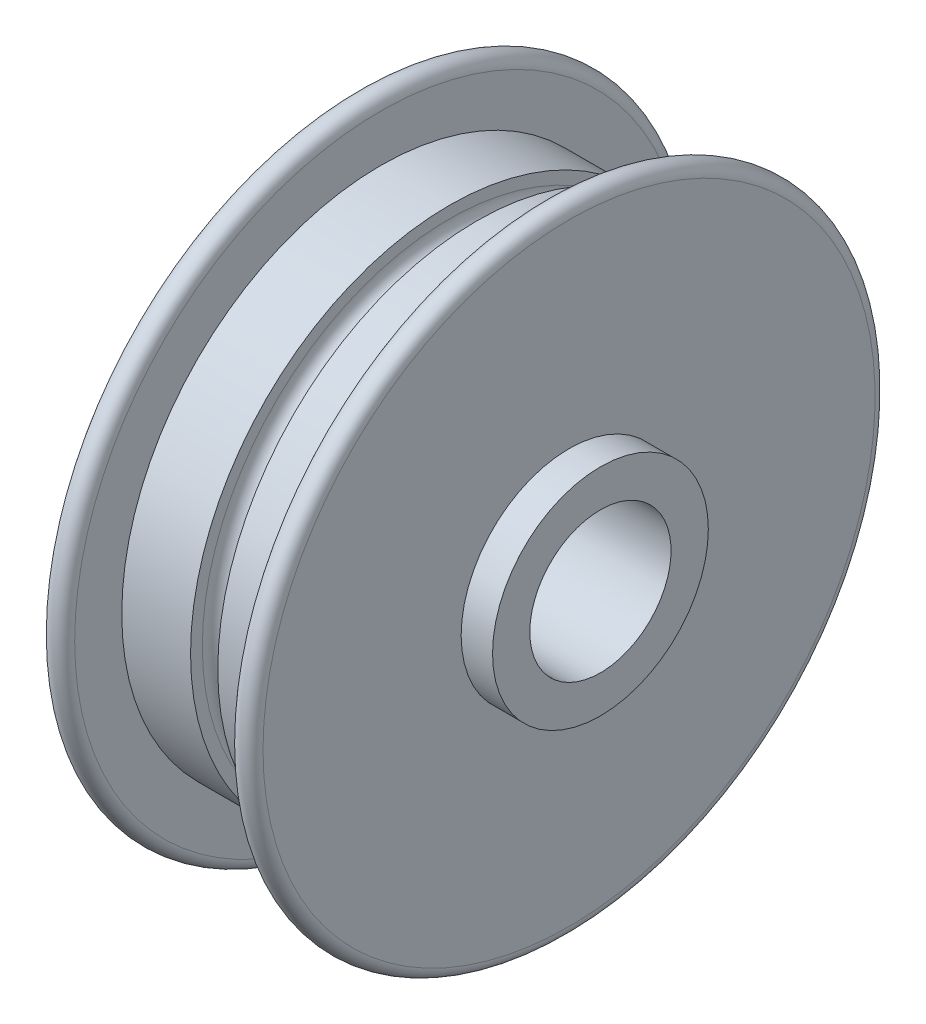
ISO-10303-21;
HEADER;
FILE_DESCRIPTION(('STEP AP214'),'2;1');
FILE_NAME('part.step','',(''),(''),'','','');
FILE_SCHEMA(('AUTOMOTIVE_DESIGN { 1 0 10303 214 1 1 1 1 }'));
ENDSEC;
DATA;
#1=APPLICATION_CONTEXT('core data for automotive mechanical design processes');
#2=APPLICATION_PROTOCOL_DEFINITION('international standard','automotive_design',2000,#1);
#3=PRODUCT_CONTEXT('',#1,'mechanical');
#4=PRODUCT('Part','Part','',(#3));
#5=PRODUCT_RELATED_PRODUCT_CATEGORY('part','',(#4));
#6=PRODUCT_DEFINITION_FORMATION('','',#4);
#7=PRODUCT_DEFINITION_CONTEXT('part definition',#1,'design');
#8=PRODUCT_DEFINITION('design','',#6,#7);
#9=PRODUCT_DEFINITION_SHAPE('','',#8);
#10=(LENGTH_UNIT() NAMED_UNIT(*) SI_UNIT(.MILLI.,.METRE.));
#11=(NAMED_UNIT(*) PLANE_ANGLE_UNIT() SI_UNIT($,.RADIAN.));
#12=(NAMED_UNIT(*) SI_UNIT($,.STERADIAN.) SOLID_ANGLE_UNIT());
#13=UNCERTAINTY_MEASURE_WITH_UNIT(LENGTH_MEASURE(1.E-05),#10,'distance_accuracy_value','');
#14=(GEOMETRIC_REPRESENTATION_CONTEXT(3) GLOBAL_UNCERTAINTY_ASSIGNED_CONTEXT((#13)) GLOBAL_UNIT_ASSIGNED_CONTEXT((#10,
#11,#12)) REPRESENTATION_CONTEXT('',''));
#15=CARTESIAN_POINT('',(0.,0.,0.));
#16=DIRECTION('',(0.,0.,1.));
#17=DIRECTION('',(1.,0.,0.));
#18=AXIS2_PLACEMENT_3D('',#15,#16,#17);
#19=CARTESIAN_POINT('',(0.,0.,0.));
#20=DIRECTION('',(-1.,0.,0.));
#21=DIRECTION('',(0.,0.,1.));
#22=AXIS2_PLACEMENT_3D('',#19,#20,#21);
#23=CYLINDRICAL_SURFACE('',#22,8.9999999793353);
#24=CARTESIAN_POINT('',(35.0006098889832,0.,0.));
#25=DIRECTION('',(-1.,0.,0.));
#26=DIRECTION('',(0.,0.,1.));
#27=AXIS2_PLACEMENT_3D('',#24,#25,#26);
#28=CIRCLE('',#27,8.9999999793353);
#29=CARTESIAN_POINT('',(35.0006098889832,0.,8.9999999793353));
#30=VERTEX_POINT('',#29);
#31=EDGE_CURVE('E10',#30,#30,#28,.T.);
#32=ORIENTED_EDGE('',*,*,#31,.F.);
#33=EDGE_LOOP('',(#32));
#34=FACE_BOUND('',#33,.T.);
#35=CARTESIAN_POINT('',(0.000609888983155578,0.,0.));
#36=DIRECTION('',(-1.,0.,0.));
#37=DIRECTION('',(0.,0.,1.));
#38=AXIS2_PLACEMENT_3D('',#35,#36,#37);
#39=CIRCLE('',#38,8.9999999793353);
#40=CARTESIAN_POINT('',(0.000609888983155578,0.,8.9999999793353));
#41=VERTEX_POINT('',#40);
#42=EDGE_CURVE('E83',#41,#41,#39,.T.);
#43=ORIENTED_EDGE('',*,*,#42,.T.);
#44=EDGE_LOOP('',(#43));
#45=FACE_BOUND('',#44,.T.);
#46=ADVANCED_FACE('F31',(#34,#45),#23,.F.);
#47=CARTESIAN_POINT('',(35.0006098889832,13.749999986474,0.));
#48=DIRECTION('',(-1.,0.,0.));
#49=DIRECTION('',(0.,0.,1.));
#50=AXIS2_PLACEMENT_3D('',#47,#48,#49);
#51=PLANE('',#50);
#52=CARTESIAN_POINT('',(35.0006098889832,0.,0.));
#53=DIRECTION('',(-1.,0.,0.));
#54=DIRECTION('',(0.,0.,1.));
#55=AXIS2_PLACEMENT_3D('',#52,#53,#54);
#56=CIRCLE('',#55,13.749999986474);
#57=CARTESIAN_POINT('',(35.0006098889832,0.,13.749999986474));
#58=VERTEX_POINT('',#57);
#59=EDGE_CURVE('E37',#58,#58,#56,.T.);
#60=ORIENTED_EDGE('',*,*,#59,.F.);
#61=EDGE_LOOP('',(#60));
#62=FACE_BOUND('',#61,.T.);
#63=ORIENTED_EDGE('',*,*,#31,.T.);
#64=EDGE_LOOP('',(#63));
#65=FACE_BOUND('',#64,.T.);
#66=ADVANCED_FACE('F168',(#62,#65),#51,.F.);
#67=CARTESIAN_POINT('',(0.,0.,0.));
#68=DIRECTION('',(-1.,0.,0.));
#69=DIRECTION('',(0.,0.,1.));
#70=AXIS2_PLACEMENT_3D('',#67,#68,#69);
#71=CYLINDRICAL_SURFACE('',#70,13.749999986474);
#72=CARTESIAN_POINT('',(31.0006098889832,0.,0.));
#73=DIRECTION('',(-1.,0.,0.));
#74=DIRECTION('',(0.,0.,1.));
#75=AXIS2_PLACEMENT_3D('',#72,#73,#74);
#76=CIRCLE('',#75,13.749999986474);
#77=CARTESIAN_POINT('',(31.0006098889832,0.,13.749999986474));
#78=VERTEX_POINT('',#77);
#79=EDGE_CURVE('E41',#78,#78,#76,.T.);
#80=ORIENTED_EDGE('',*,*,#79,.F.);
#81=EDGE_LOOP('',(#80));
#82=FACE_BOUND('',#81,.T.);
#83=ORIENTED_EDGE('',*,*,#59,.T.);
#84=EDGE_LOOP('',(#83));
#85=FACE_BOUND('',#84,.T.);
#86=ADVANCED_FACE('F163',(#82,#85),#71,.T.);
#87=CARTESIAN_POINT('',(31.0006098889832,39.,0.));
#88=DIRECTION('',(-1.,0.,0.));
#89=DIRECTION('',(0.,0.,1.));
#90=AXIS2_PLACEMENT_3D('',#87,#88,#89);
#91=PLANE('',#90);
#92=CARTESIAN_POINT('',(31.0006098889832,0.,0.));
#93=DIRECTION('',(-1.,0.,0.));
#94=DIRECTION('',(0.,0.,1.));
#95=AXIS2_PLACEMENT_3D('',#92,#93,#94);
#96=CIRCLE('',#95,39.);
#97=CARTESIAN_POINT('',(31.0006098889832,0.,39.));
#98=VERTEX_POINT('',#97);
#99=EDGE_CURVE('E45',#98,#98,#96,.T.);
#100=ORIENTED_EDGE('',*,*,#99,.F.);
#101=EDGE_LOOP('',(#100));
#102=FACE_BOUND('',#101,.T.);
#103=ORIENTED_EDGE('',*,*,#79,.T.);
#104=EDGE_LOOP('',(#103));
#105=FACE_BOUND('',#104,.T.);
#106=ADVANCED_FACE('F157',(#102,#105),#91,.F.);
#107=CARTESIAN_POINT('',(29.5006098889832,0.,0.));
#108=DIRECTION('',(-1.,0.,0.));
#109=DIRECTION('',(0.,0.,1.));
#110=AXIS2_PLACEMENT_3D('',#107,#108,#109);
#111=TOROIDAL_SURFACE('',#110,39.,1.5);
#112=CARTESIAN_POINT('',(28.0006098889832,0.,0.));
#113=DIRECTION('',(-1.,0.,0.));
#114=DIRECTION('',(0.,0.,1.));
#115=AXIS2_PLACEMENT_3D('',#112,#113,#114);
#116=CIRCLE('',#115,39.);
#117=CARTESIAN_POINT('',(28.0006098889832,0.,39.));
#118=VERTEX_POINT('',#117);
#119=EDGE_CURVE('E50',#118,#118,#116,.T.);
#120=ORIENTED_EDGE('',*,*,#119,.F.);
#121=EDGE_LOOP('',(#120));
#122=FACE_BOUND('',#121,.T.);
#123=ORIENTED_EDGE('',*,*,#99,.T.);
#124=EDGE_LOOP('',(#123));
#125=FACE_BOUND('',#124,.T.);
#126=ADVANCED_FACE('F151',(#122,#125),#111,.T.);
#127=CARTESIAN_POINT('',(28.0006098889832,33.,0.));
#128=DIRECTION('',(1.,0.,0.));
#129=DIRECTION('',(0.,0.,-1.));
#130=AXIS2_PLACEMENT_3D('',#127,#128,#129);
#131=PLANE('',#130);
#132=CARTESIAN_POINT('',(28.0006098889832,0.,0.));
#133=DIRECTION('',(-1.,0.,0.));
#134=DIRECTION('',(0.,0.,1.));
#135=AXIS2_PLACEMENT_3D('',#132,#133,#134);
#136=CIRCLE('',#135,33.);
#137=CARTESIAN_POINT('',(28.0006098889832,0.,33.));
#138=VERTEX_POINT('',#137);
#139=EDGE_CURVE('E53',#138,#138,#136,.T.);
#140=ORIENTED_EDGE('',*,*,#139,.F.);
#141=EDGE_LOOP('',(#140));
#142=FACE_BOUND('',#141,.T.);
#143=ORIENTED_EDGE('',*,*,#119,.T.);
#144=EDGE_LOOP('',(#143));
#145=FACE_BOUND('',#144,.T.);
#146=ADVANCED_FACE('F145',(#142,#145),#131,.F.);
#147=CARTESIAN_POINT('',(0.,0.,0.));
#148=DIRECTION('',(-1.,0.,0.));
#149=DIRECTION('',(0.,0.,1.));
#150=AXIS2_PLACEMENT_3D('',#147,#148,#149);
#151=CYLINDRICAL_SURFACE('',#150,33.);
#152=CARTESIAN_POINT('',(19.2353227115084,0.,0.));
#153=DIRECTION('',(-1.,0.,0.));
#154=DIRECTION('',(0.,0.,1.));
#155=AXIS2_PLACEMENT_3D('',#152,#153,#154);
#156=CIRCLE('',#155,33.);
#157=CARTESIAN_POINT('',(19.2353227115084,0.,33.));
#158=VERTEX_POINT('',#157);
#159=EDGE_CURVE('E56',#158,#158,#156,.T.);
#160=ORIENTED_EDGE('',*,*,#159,.F.);
#161=EDGE_LOOP('',(#160));
#162=FACE_BOUND('',#161,.T.);
#163=ORIENTED_EDGE('',*,*,#139,.T.);
#164=EDGE_LOOP('',(#163));
#165=FACE_BOUND('',#164,.T.);
#166=ADVANCED_FACE('F139',(#162,#165),#151,.T.);
#167=CARTESIAN_POINT('',(19.2353227115084,31.5,0.));
#168=DIRECTION('',(1.,0.,0.));
#169=DIRECTION('',(0.,0.,-1.));
#170=AXIS2_PLACEMENT_3D('',#167,#168,#169);
#171=PLANE('',#170);
#172=CARTESIAN_POINT('',(19.2353227115084,0.,0.));
#173=DIRECTION('',(-1.,0.,0.));
#174=DIRECTION('',(0.,0.,1.));
#175=AXIS2_PLACEMENT_3D('',#172,#173,#174);
#176=CIRCLE('',#175,31.5);
#177=CARTESIAN_POINT('',(19.2353227115084,0.,31.5));
#178=VERTEX_POINT('',#177);
#179=EDGE_CURVE('E59',#178,#178,#176,.T.);
#180=ORIENTED_EDGE('',*,*,#179,.F.);
#181=EDGE_LOOP('',(#180));
#182=FACE_BOUND('',#181,.T.);
#183=ORIENTED_EDGE('',*,*,#159,.T.);
#184=EDGE_LOOP('',(#183));
#185=FACE_BOUND('',#184,.T.);
#186=ADVANCED_FACE('F133',(#182,#185),#171,.F.);
#187=CARTESIAN_POINT('',(17.5006098889832,0.,0.));
#188=DIRECTION('',(-1.,0.,0.));
#189=DIRECTION('',(0.,0.,1.));
#190=AXIS2_PLACEMENT_3D('',#187,#188,#189);
#191=TOROIDAL_SURFACE('',#190,31.2691939702551,1.75);
#192=CARTESIAN_POINT('',(15.7658970664579,0.,0.));
#193=DIRECTION('',(-1.,0.,0.));
#194=DIRECTION('',(0.,0.,1.));
#195=AXIS2_PLACEMENT_3D('',#192,#193,#194);
#196=CIRCLE('',#195,31.5);
#197=CARTESIAN_POINT('',(15.7658970664579,0.,31.5));
#198=VERTEX_POINT('',#197);
#199=EDGE_CURVE('E62',#198,#198,#196,.T.);
#200=ORIENTED_EDGE('',*,*,#199,.F.);
#201=EDGE_LOOP('',(#200));
#202=FACE_BOUND('',#201,.T.);
#203=ORIENTED_EDGE('',*,*,#179,.T.);
#204=EDGE_LOOP('',(#203));
#205=FACE_BOUND('',#204,.T.);
#206=ADVANCED_FACE('F127',(#202,#205),#191,.F.);
#207=CARTESIAN_POINT('',(15.7658970664579,33.,0.));
#208=DIRECTION('',(-1.,0.,0.));
#209=DIRECTION('',(0.,0.,1.));
#210=AXIS2_PLACEMENT_3D('',#207,#208,#209);
#211=PLANE('',#210);
#212=CARTESIAN_POINT('',(15.7658970664579,0.,0.));
#213=DIRECTION('',(-1.,0.,0.));
#214=DIRECTION('',(0.,0.,1.));
#215=AXIS2_PLACEMENT_3D('',#212,#213,#214);
#216=CIRCLE('',#215,33.);
#217=CARTESIAN_POINT('',(15.7658970664579,0.,33.));
#218=VERTEX_POINT('',#217);
#219=EDGE_CURVE('E65',#218,#218,#216,.T.);
#220=ORIENTED_EDGE('',*,*,#219,.F.);
#221=EDGE_LOOP('',(#220));
#222=FACE_BOUND('',#221,.T.);
#223=ORIENTED_EDGE('',*,*,#199,.T.);
#224=EDGE_LOOP('',(#223));
#225=FACE_BOUND('',#224,.T.);
#226=ADVANCED_FACE('F121',(#222,#225),#211,.F.);
#227=CARTESIAN_POINT('',(0.,0.,0.));
#228=DIRECTION('',(-1.,0.,0.));
#229=DIRECTION('',(0.,0.,1.));
#230=AXIS2_PLACEMENT_3D('',#227,#228,#229);
#231=CYLINDRICAL_SURFACE('',#230,33.);
#232=CARTESIAN_POINT('',(7.00060988898316,0.,0.));
#233=DIRECTION('',(-1.,0.,0.));
#234=DIRECTION('',(0.,0.,1.));
#235=AXIS2_PLACEMENT_3D('',#232,#233,#234);
#236=CIRCLE('',#235,33.);
#237=CARTESIAN_POINT('',(7.00060988898316,0.,33.));
#238=VERTEX_POINT('',#237);
#239=EDGE_CURVE('E68',#238,#238,#236,.T.);
#240=ORIENTED_EDGE('',*,*,#239,.F.);
#241=EDGE_LOOP('',(#240));
#242=FACE_BOUND('',#241,.T.);
#243=ORIENTED_EDGE('',*,*,#219,.T.);
#244=EDGE_LOOP('',(#243));
#245=FACE_BOUND('',#244,.T.);
#246=ADVANCED_FACE('F115',(#242,#245),#231,.T.);
#247=CARTESIAN_POINT('',(7.00060988898316,39.,0.));
#248=DIRECTION('',(-1.,0.,0.));
#249=DIRECTION('',(0.,0.,1.));
#250=AXIS2_PLACEMENT_3D('',#247,#248,#249);
#251=PLANE('',#250);
#252=CARTESIAN_POINT('',(7.00060988898316,0.,0.));
#253=DIRECTION('',(-1.,0.,0.));
#254=DIRECTION('',(0.,0.,1.));
#255=AXIS2_PLACEMENT_3D('',#252,#253,#254);
#256=CIRCLE('',#255,39.);
#257=CARTESIAN_POINT('',(7.00060988898316,0.,39.));
#258=VERTEX_POINT('',#257);
#259=EDGE_CURVE('E71',#258,#258,#256,.T.);
#260=ORIENTED_EDGE('',*,*,#259,.F.);
#261=EDGE_LOOP('',(#260));
#262=FACE_BOUND('',#261,.T.);
#263=ORIENTED_EDGE('',*,*,#239,.T.);
#264=EDGE_LOOP('',(#263));
#265=FACE_BOUND('',#264,.T.);
#266=ADVANCED_FACE('F109',(#262,#265),#251,.F.);
#267=CARTESIAN_POINT('',(5.50060988898316,0.,0.));
#268=DIRECTION('',(-1.,0.,0.));
#269=DIRECTION('',(0.,0.,1.));
#270=AXIS2_PLACEMENT_3D('',#267,#268,#269);
#271=TOROIDAL_SURFACE('',#270,39.,1.5);
#272=CARTESIAN_POINT('',(4.00060988898316,0.,0.));
#273=DIRECTION('',(-1.,0.,0.));
#274=DIRECTION('',(0.,0.,1.));
#275=AXIS2_PLACEMENT_3D('',#272,#273,#274);
#276=CIRCLE('',#275,39.);
#277=CARTESIAN_POINT('',(4.00060988898316,0.,39.));
#278=VERTEX_POINT('',#277);
#279=EDGE_CURVE('E74',#278,#278,#276,.T.);
#280=ORIENTED_EDGE('',*,*,#279,.F.);
#281=EDGE_LOOP('',(#280));
#282=FACE_BOUND('',#281,.T.);
#283=ORIENTED_EDGE('',*,*,#259,.T.);
#284=EDGE_LOOP('',(#283));
#285=FACE_BOUND('',#284,.T.);
#286=ADVANCED_FACE('F103',(#282,#285),#271,.T.);
#287=CARTESIAN_POINT('',(4.00060988898316,13.749999986474,0.));
#288=DIRECTION('',(1.,0.,0.));
#289=DIRECTION('',(0.,0.,-1.));
#290=AXIS2_PLACEMENT_3D('',#287,#288,#289);
#291=PLANE('',#290);
#292=CARTESIAN_POINT('',(4.00060988898316,0.,0.));
#293=DIRECTION('',(-1.,0.,0.));
#294=DIRECTION('',(0.,0.,1.));
#295=AXIS2_PLACEMENT_3D('',#292,#293,#294);
#296=CIRCLE('',#295,13.749999986474);
#297=CARTESIAN_POINT('',(4.00060988898316,0.,13.749999986474));
#298=VERTEX_POINT('',#297);
#299=EDGE_CURVE('E77',#298,#298,#296,.T.);
#300=ORIENTED_EDGE('',*,*,#299,.F.);
#301=EDGE_LOOP('',(#300));
#302=FACE_BOUND('',#301,.T.);
#303=ORIENTED_EDGE('',*,*,#279,.T.);
#304=EDGE_LOOP('',(#303));
#305=FACE_BOUND('',#304,.T.);
#306=ADVANCED_FACE('F97',(#302,#305),#291,.F.);
#307=CARTESIAN_POINT('',(0.,0.,0.));
#308=DIRECTION('',(-1.,0.,0.));
#309=DIRECTION('',(0.,0.,1.));
#310=AXIS2_PLACEMENT_3D('',#307,#308,#309);
#311=CYLINDRICAL_SURFACE('',#310,13.749999986474);
#312=CARTESIAN_POINT('',(0.000609888983155578,0.,0.));
#313=DIRECTION('',(-1.,0.,0.));
#314=DIRECTION('',(0.,0.,1.));
#315=AXIS2_PLACEMENT_3D('',#312,#313,#314);
#316=CIRCLE('',#315,13.749999986474);
#317=CARTESIAN_POINT('',(0.000609888983155578,0.,13.749999986474));
#318=VERTEX_POINT('',#317);
#319=EDGE_CURVE('E80',#318,#318,#316,.T.);
#320=ORIENTED_EDGE('',*,*,#319,.F.);
#321=EDGE_LOOP('',(#320));
#322=FACE_BOUND('',#321,.T.);
#323=ORIENTED_EDGE('',*,*,#299,.T.);
#324=EDGE_LOOP('',(#323));
#325=FACE_BOUND('',#324,.T.);
#326=ADVANCED_FACE('F91',(#322,#325),#311,.T.);
#327=CARTESIAN_POINT('',(0.000609888983155578,8.9999999793353,0.));
#328=DIRECTION('',(1.,0.,0.));
#329=DIRECTION('',(0.,0.,-1.));
#330=AXIS2_PLACEMENT_3D('',#327,#328,#329);
#331=PLANE('',#330);
#332=ORIENTED_EDGE('',*,*,#42,.F.);
#333=EDGE_LOOP('',(#332));
#334=FACE_BOUND('',#333,.T.);
#335=ORIENTED_EDGE('',*,*,#319,.T.);
#336=EDGE_LOOP('',(#335));
#337=FACE_BOUND('',#336,.T.);
#338=ADVANCED_FACE('F88',(#334,#337),#331,.F.);
#339=CLOSED_SHELL('',(#46,#66,#86,#106,#126,#146,#166,#186,#206,#226,#246,#266,#286,#306,#326,#338));
#340=MANIFOLD_SOLID_BREP('B2',#339);
#341=ADVANCED_BREP_SHAPE_REPRESENTATION('',(#18,#340),#14);
#342=SHAPE_DEFINITION_REPRESENTATION(#9,#341);
ENDSEC;
END-ISO-10303-21;
